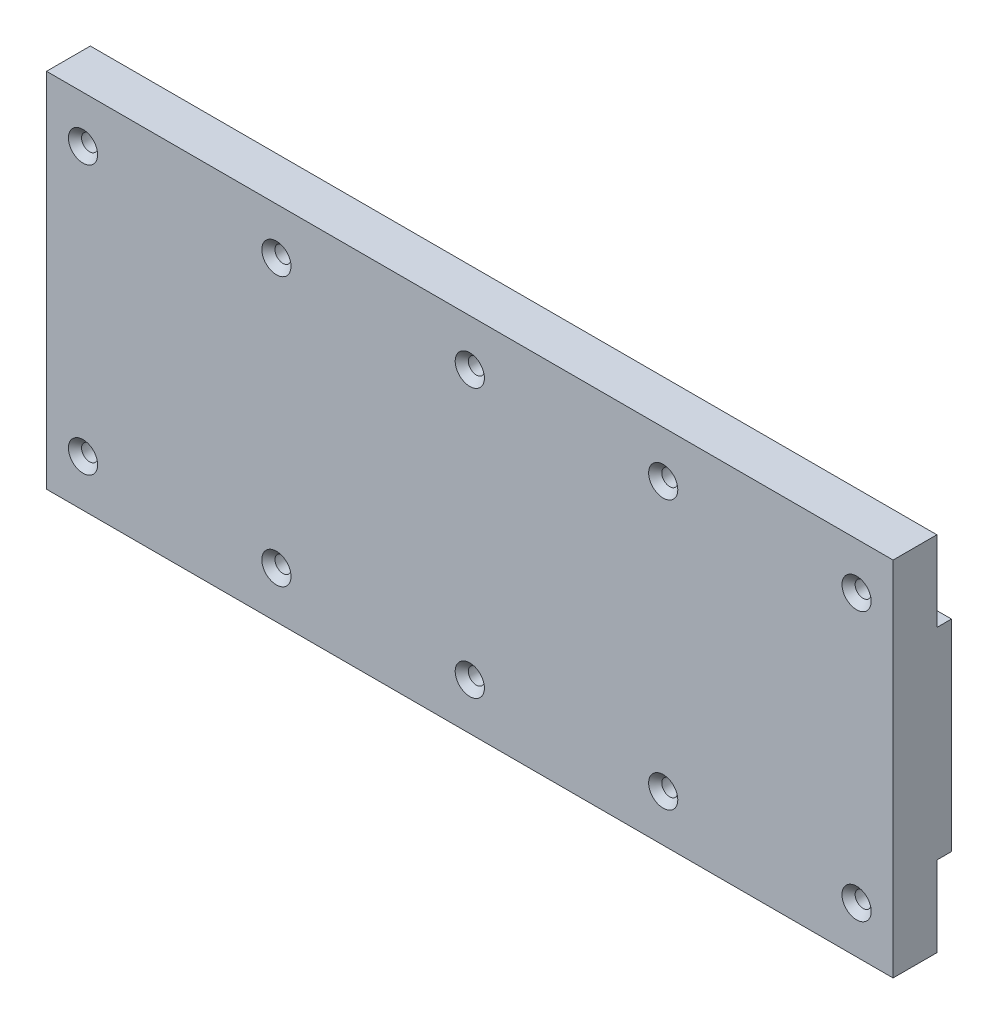
ISO-10303-21;
HEADER;
FILE_DESCRIPTION(('STEP AP214'),'2;1');
FILE_NAME('part.step','',(''),(''),'','','');
FILE_SCHEMA(('AUTOMOTIVE_DESIGN { 1 0 10303 214 1 1 1 1 }'));
ENDSEC;
DATA;
#1=APPLICATION_CONTEXT('core data for automotive mechanical design processes');
#2=APPLICATION_PROTOCOL_DEFINITION('international standard','automotive_design',2000,#1);
#3=PRODUCT_CONTEXT('',#1,'mechanical');
#4=PRODUCT('Part','Part','',(#3));
#5=PRODUCT_RELATED_PRODUCT_CATEGORY('part','',(#4));
#6=PRODUCT_DEFINITION_FORMATION('','',#4);
#7=PRODUCT_DEFINITION_CONTEXT('part definition',#1,'design');
#8=PRODUCT_DEFINITION('design','',#6,#7);
#9=PRODUCT_DEFINITION_SHAPE('','',#8);
#10=(LENGTH_UNIT() NAMED_UNIT(*) SI_UNIT(.MILLI.,.METRE.));
#11=(NAMED_UNIT(*) PLANE_ANGLE_UNIT() SI_UNIT($,.RADIAN.));
#12=(NAMED_UNIT(*) SI_UNIT($,.STERADIAN.) SOLID_ANGLE_UNIT());
#13=UNCERTAINTY_MEASURE_WITH_UNIT(LENGTH_MEASURE(1.E-05),#10,'distance_accuracy_value','');
#14=(GEOMETRIC_REPRESENTATION_CONTEXT(3) GLOBAL_UNCERTAINTY_ASSIGNED_CONTEXT((#13)) GLOBAL_UNIT_ASSIGNED_CONTEXT((#10,
#11,#12)) REPRESENTATION_CONTEXT('',''));
#15=CARTESIAN_POINT('',(0.,0.,0.));
#16=DIRECTION('',(0.,0.,1.));
#17=DIRECTION('',(1.,0.,0.));
#18=AXIS2_PLACEMENT_3D('',#15,#16,#17);
#19=CARTESIAN_POINT('',(265.,-92.,0.));
#20=DIRECTION('',(0.,0.,1.));
#21=DIRECTION('',(1.,0.,0.));
#22=AXIS2_PLACEMENT_3D('',#19,#20,#21);
#23=CONICAL_SURFACE('',#22,10.,0.78539816339745);
#24=CARTESIAN_POINT('',(265.,-92.,-4.49999999999999));
#25=DIRECTION('',(0.,0.,1.));
#26=DIRECTION('',(1.,0.,0.));
#27=AXIS2_PLACEMENT_3D('',#24,#25,#26);
#28=CIRCLE('',#27,5.50000000000001);
#29=CARTESIAN_POINT('',(270.5,-92.,-4.49999999999999));
#30=VERTEX_POINT('',#29);
#31=EDGE_CURVE('E11',#30,#30,#28,.T.);
#32=ORIENTED_EDGE('',*,*,#31,.F.);
#33=EDGE_LOOP('',(#32));
#34=FACE_BOUND('',#33,.T.);
#35=CARTESIAN_POINT('',(265.,-92.,0.));
#36=DIRECTION('',(0.,0.,1.));
#37=DIRECTION('',(1.,0.,0.));
#38=AXIS2_PLACEMENT_3D('',#35,#36,#37);
#39=CIRCLE('',#38,10.);
#40=CARTESIAN_POINT('',(275.,-92.,0.));
#41=VERTEX_POINT('',#40);
#42=EDGE_CURVE('E217',#41,#41,#39,.T.);
#43=ORIENTED_EDGE('',*,*,#42,.T.);
#44=EDGE_LOOP('',(#43));
#45=FACE_BOUND('',#44,.T.);
#46=ADVANCED_FACE('F33',(#34,#45),#23,.F.);
#47=CARTESIAN_POINT('',(265.,-92.,0.));
#48=DIRECTION('',(0.,0.,1.));
#49=DIRECTION('',(1.,0.,0.));
#50=AXIS2_PLACEMENT_3D('',#47,#48,#49);
#51=CYLINDRICAL_SURFACE('',#50,5.50000000000001);
#52=CARTESIAN_POINT('',(265.,-92.,-30.));
#53=DIRECTION('',(0.,0.,-1.));
#54=DIRECTION('',(0.,1.,0.));
#55=AXIS2_PLACEMENT_3D('',#52,#53,#54);
#56=CIRCLE('',#55,5.50000000000001);
#57=CARTESIAN_POINT('',(265.,-86.5,-30.));
#58=VERTEX_POINT('',#57);
#59=EDGE_CURVE('E40',#58,#58,#56,.T.);
#60=ORIENTED_EDGE('',*,*,#59,.T.);
#61=EDGE_LOOP('',(#60));
#62=FACE_BOUND('',#61,.T.);
#63=ORIENTED_EDGE('',*,*,#31,.T.);
#64=EDGE_LOOP('',(#63));
#65=FACE_BOUND('',#64,.T.);
#66=ADVANCED_FACE('F222',(#62,#65),#51,.F.);
#67=CARTESIAN_POINT('',(132.5,-92.,0.));
#68=DIRECTION('',(0.,0.,1.));
#69=DIRECTION('',(1.,0.,0.));
#70=AXIS2_PLACEMENT_3D('',#67,#68,#69);
#71=CONICAL_SURFACE('',#70,10.,0.78539816339745);
#72=CARTESIAN_POINT('',(132.5,-92.,-4.49999999999999));
#73=DIRECTION('',(0.,0.,1.));
#74=DIRECTION('',(1.,0.,0.));
#75=AXIS2_PLACEMENT_3D('',#72,#73,#74);
#76=CIRCLE('',#75,5.50000000000001);
#77=CARTESIAN_POINT('',(138.,-92.,-4.49999999999999));
#78=VERTEX_POINT('',#77);
#79=EDGE_CURVE('E214',#78,#78,#76,.T.);
#80=ORIENTED_EDGE('',*,*,#79,.F.);
#81=EDGE_LOOP('',(#80));
#82=FACE_BOUND('',#81,.T.);
#83=CARTESIAN_POINT('',(132.5,-92.,0.));
#84=DIRECTION('',(0.,0.,1.));
#85=DIRECTION('',(1.,0.,0.));
#86=AXIS2_PLACEMENT_3D('',#83,#84,#85);
#87=CIRCLE('',#86,10.);
#88=CARTESIAN_POINT('',(142.5,-92.,0.));
#89=VERTEX_POINT('',#88);
#90=EDGE_CURVE('E208',#89,#89,#87,.T.);
#91=ORIENTED_EDGE('',*,*,#90,.T.);
#92=EDGE_LOOP('',(#91));
#93=FACE_BOUND('',#92,.T.);
#94=ADVANCED_FACE('F252',(#82,#93),#71,.F.);
#95=CARTESIAN_POINT('',(132.5,-92.,0.));
#96=DIRECTION('',(0.,0.,1.));
#97=DIRECTION('',(1.,0.,0.));
#98=AXIS2_PLACEMENT_3D('',#95,#96,#97);
#99=CYLINDRICAL_SURFACE('',#98,5.50000000000001);
#100=CARTESIAN_POINT('',(132.5,-92.,-30.));
#101=DIRECTION('',(0.,0.,-1.));
#102=DIRECTION('',(0.,1.,0.));
#103=AXIS2_PLACEMENT_3D('',#100,#101,#102);
#104=CIRCLE('',#103,5.50000000000001);
#105=CARTESIAN_POINT('',(132.5,-86.5,-30.));
#106=VERTEX_POINT('',#105);
#107=EDGE_CURVE('E211',#106,#106,#104,.T.);
#108=ORIENTED_EDGE('',*,*,#107,.T.);
#109=EDGE_LOOP('',(#108));
#110=FACE_BOUND('',#109,.T.);
#111=ORIENTED_EDGE('',*,*,#79,.T.);
#112=EDGE_LOOP('',(#111));
#113=FACE_BOUND('',#112,.T.);
#114=ADVANCED_FACE('F301',(#110,#113),#99,.F.);
#115=CARTESIAN_POINT('',(0.,-92.,0.));
#116=DIRECTION('',(0.,0.,1.));
#117=DIRECTION('',(1.,0.,0.));
#118=AXIS2_PLACEMENT_3D('',#115,#116,#117);
#119=CONICAL_SURFACE('',#118,10.,0.78539816339745);
#120=CARTESIAN_POINT('',(0.,-92.,-4.49999999999999));
#121=DIRECTION('',(0.,0.,1.));
#122=DIRECTION('',(1.,0.,0.));
#123=AXIS2_PLACEMENT_3D('',#120,#121,#122);
#124=CIRCLE('',#123,5.50000000000001);
#125=CARTESIAN_POINT('',(5.50000000000001,-92.,-4.49999999999999));
#126=VERTEX_POINT('',#125);
#127=EDGE_CURVE('E205',#126,#126,#124,.T.);
#128=ORIENTED_EDGE('',*,*,#127,.F.);
#129=EDGE_LOOP('',(#128));
#130=FACE_BOUND('',#129,.T.);
#131=CARTESIAN_POINT('',(0.,-92.,0.));
#132=DIRECTION('',(0.,0.,1.));
#133=DIRECTION('',(1.,0.,0.));
#134=AXIS2_PLACEMENT_3D('',#131,#132,#133);
#135=CIRCLE('',#134,10.);
#136=CARTESIAN_POINT('',(10.,-92.,0.));
#137=VERTEX_POINT('',#136);
#138=EDGE_CURVE('E199',#137,#137,#135,.T.);
#139=ORIENTED_EDGE('',*,*,#138,.T.);
#140=EDGE_LOOP('',(#139));
#141=FACE_BOUND('',#140,.T.);
#142=ADVANCED_FACE('F297',(#130,#141),#119,.F.);
#143=CARTESIAN_POINT('',(0.,-92.,0.));
#144=DIRECTION('',(0.,0.,1.));
#145=DIRECTION('',(1.,0.,0.));
#146=AXIS2_PLACEMENT_3D('',#143,#144,#145);
#147=CYLINDRICAL_SURFACE('',#146,5.50000000000001);
#148=CARTESIAN_POINT('',(0.,-92.,-30.));
#149=DIRECTION('',(0.,0.,-1.));
#150=DIRECTION('',(0.,1.,0.));
#151=AXIS2_PLACEMENT_3D('',#148,#149,#150);
#152=CIRCLE('',#151,5.50000000000001);
#153=CARTESIAN_POINT('',(0.,-86.5,-30.));
#154=VERTEX_POINT('',#153);
#155=EDGE_CURVE('E202',#154,#154,#152,.T.);
#156=ORIENTED_EDGE('',*,*,#155,.T.);
#157=EDGE_LOOP('',(#156));
#158=FACE_BOUND('',#157,.T.);
#159=ORIENTED_EDGE('',*,*,#127,.T.);
#160=EDGE_LOOP('',(#159));
#161=FACE_BOUND('',#160,.T.);
#162=ADVANCED_FACE('F293',(#158,#161),#147,.F.);
#163=CARTESIAN_POINT('',(265.,92.,0.));
#164=DIRECTION('',(0.,0.,1.));
#165=DIRECTION('',(1.,0.,0.));
#166=AXIS2_PLACEMENT_3D('',#163,#164,#165);
#167=CONICAL_SURFACE('',#166,10.,0.78539816339745);
#168=CARTESIAN_POINT('',(265.,92.,-4.49999999999999));
#169=DIRECTION('',(0.,0.,1.));
#170=DIRECTION('',(1.,0.,0.));
#171=AXIS2_PLACEMENT_3D('',#168,#169,#170);
#172=CIRCLE('',#171,5.50000000000001);
#173=CARTESIAN_POINT('',(270.5,92.,-4.49999999999999));
#174=VERTEX_POINT('',#173);
#175=EDGE_CURVE('E196',#174,#174,#172,.T.);
#176=ORIENTED_EDGE('',*,*,#175,.F.);
#177=EDGE_LOOP('',(#176));
#178=FACE_BOUND('',#177,.T.);
#179=CARTESIAN_POINT('',(265.,92.,0.));
#180=DIRECTION('',(0.,0.,1.));
#181=DIRECTION('',(1.,0.,0.));
#182=AXIS2_PLACEMENT_3D('',#179,#180,#181);
#183=CIRCLE('',#182,10.);
#184=CARTESIAN_POINT('',(275.,92.,0.));
#185=VERTEX_POINT('',#184);
#186=EDGE_CURVE('E190',#185,#185,#183,.T.);
#187=ORIENTED_EDGE('',*,*,#186,.T.);
#188=EDGE_LOOP('',(#187));
#189=FACE_BOUND('',#188,.T.);
#190=ADVANCED_FACE('F289',(#178,#189),#167,.F.);
#191=CARTESIAN_POINT('',(265.,92.,0.));
#192=DIRECTION('',(0.,0.,1.));
#193=DIRECTION('',(1.,0.,0.));
#194=AXIS2_PLACEMENT_3D('',#191,#192,#193);
#195=CYLINDRICAL_SURFACE('',#194,5.50000000000001);
#196=CARTESIAN_POINT('',(265.,92.,-30.));
#197=DIRECTION('',(0.,0.,-1.));
#198=DIRECTION('',(0.,1.,0.));
#199=AXIS2_PLACEMENT_3D('',#196,#197,#198);
#200=CIRCLE('',#199,5.50000000000001);
#201=CARTESIAN_POINT('',(265.,97.5,-29.9999999999999));
#202=VERTEX_POINT('',#201);
#203=EDGE_CURVE('E193',#202,#202,#200,.T.);
#204=ORIENTED_EDGE('',*,*,#203,.T.);
#205=EDGE_LOOP('',(#204));
#206=FACE_BOUND('',#205,.T.);
#207=ORIENTED_EDGE('',*,*,#175,.T.);
#208=EDGE_LOOP('',(#207));
#209=FACE_BOUND('',#208,.T.);
#210=ADVANCED_FACE('F285',(#206,#209),#195,.F.);
#211=CARTESIAN_POINT('',(132.5,92.,0.));
#212=DIRECTION('',(0.,0.,1.));
#213=DIRECTION('',(1.,0.,0.));
#214=AXIS2_PLACEMENT_3D('',#211,#212,#213);
#215=CONICAL_SURFACE('',#214,10.,0.78539816339745);
#216=CARTESIAN_POINT('',(132.5,92.,-4.49999999999999));
#217=DIRECTION('',(0.,0.,1.));
#218=DIRECTION('',(1.,0.,0.));
#219=AXIS2_PLACEMENT_3D('',#216,#217,#218);
#220=CIRCLE('',#219,5.50000000000001);
#221=CARTESIAN_POINT('',(138.,92.,-4.49999999999999));
#222=VERTEX_POINT('',#221);
#223=EDGE_CURVE('E187',#222,#222,#220,.T.);
#224=ORIENTED_EDGE('',*,*,#223,.F.);
#225=EDGE_LOOP('',(#224));
#226=FACE_BOUND('',#225,.T.);
#227=CARTESIAN_POINT('',(132.5,92.,0.));
#228=DIRECTION('',(0.,0.,1.));
#229=DIRECTION('',(1.,0.,0.));
#230=AXIS2_PLACEMENT_3D('',#227,#228,#229);
#231=CIRCLE('',#230,10.);
#232=CARTESIAN_POINT('',(142.5,92.,0.));
#233=VERTEX_POINT('',#232);
#234=EDGE_CURVE('E181',#233,#233,#231,.T.);
#235=ORIENTED_EDGE('',*,*,#234,.T.);
#236=EDGE_LOOP('',(#235));
#237=FACE_BOUND('',#236,.T.);
#238=ADVANCED_FACE('F281',(#226,#237),#215,.F.);
#239=CARTESIAN_POINT('',(132.5,92.,0.));
#240=DIRECTION('',(0.,0.,1.));
#241=DIRECTION('',(1.,0.,0.));
#242=AXIS2_PLACEMENT_3D('',#239,#240,#241);
#243=CYLINDRICAL_SURFACE('',#242,5.50000000000001);
#244=CARTESIAN_POINT('',(132.5,92.,-30.));
#245=DIRECTION('',(0.,0.,-1.));
#246=DIRECTION('',(0.,1.,0.));
#247=AXIS2_PLACEMENT_3D('',#244,#245,#246);
#248=CIRCLE('',#247,5.50000000000001);
#249=CARTESIAN_POINT('',(132.5,97.5,-29.9999999999999));
#250=VERTEX_POINT('',#249);
#251=EDGE_CURVE('E184',#250,#250,#248,.T.);
#252=ORIENTED_EDGE('',*,*,#251,.T.);
#253=EDGE_LOOP('',(#252));
#254=FACE_BOUND('',#253,.T.);
#255=ORIENTED_EDGE('',*,*,#223,.T.);
#256=EDGE_LOOP('',(#255));
#257=FACE_BOUND('',#256,.T.);
#258=ADVANCED_FACE('F277',(#254,#257),#243,.F.);
#259=CARTESIAN_POINT('',(0.,92.,0.));
#260=DIRECTION('',(0.,0.,1.));
#261=DIRECTION('',(1.,0.,0.));
#262=AXIS2_PLACEMENT_3D('',#259,#260,#261);
#263=CONICAL_SURFACE('',#262,10.,0.78539816339745);
#264=CARTESIAN_POINT('',(0.,92.,-4.49999999999999));
#265=DIRECTION('',(0.,0.,1.));
#266=DIRECTION('',(1.,0.,0.));
#267=AXIS2_PLACEMENT_3D('',#264,#265,#266);
#268=CIRCLE('',#267,5.50000000000001);
#269=CARTESIAN_POINT('',(5.50000000000001,92.,-4.49999999999999));
#270=VERTEX_POINT('',#269);
#271=EDGE_CURVE('E178',#270,#270,#268,.T.);
#272=ORIENTED_EDGE('',*,*,#271,.F.);
#273=EDGE_LOOP('',(#272));
#274=FACE_BOUND('',#273,.T.);
#275=CARTESIAN_POINT('',(0.,92.,0.));
#276=DIRECTION('',(0.,0.,1.));
#277=DIRECTION('',(1.,0.,0.));
#278=AXIS2_PLACEMENT_3D('',#275,#276,#277);
#279=CIRCLE('',#278,10.);
#280=CARTESIAN_POINT('',(10.,92.,0.));
#281=VERTEX_POINT('',#280);
#282=EDGE_CURVE('E157',#281,#281,#279,.T.);
#283=ORIENTED_EDGE('',*,*,#282,.T.);
#284=EDGE_LOOP('',(#283));
#285=FACE_BOUND('',#284,.T.);
#286=ADVANCED_FACE('F273',(#274,#285),#263,.F.);
#287=CARTESIAN_POINT('',(0.,92.,0.));
#288=DIRECTION('',(0.,0.,1.));
#289=DIRECTION('',(1.,0.,0.));
#290=AXIS2_PLACEMENT_3D('',#287,#288,#289);
#291=CYLINDRICAL_SURFACE('',#290,5.50000000000001);
#292=CARTESIAN_POINT('',(0.,92.,-30.));
#293=DIRECTION('',(0.,0.,-1.));
#294=DIRECTION('',(0.,1.,0.));
#295=AXIS2_PLACEMENT_3D('',#292,#293,#294);
#296=CIRCLE('',#295,5.50000000000001);
#297=CARTESIAN_POINT('',(0.,97.5,-29.9999999999999));
#298=VERTEX_POINT('',#297);
#299=EDGE_CURVE('E175',#298,#298,#296,.T.);
#300=ORIENTED_EDGE('',*,*,#299,.T.);
#301=EDGE_LOOP('',(#300));
#302=FACE_BOUND('',#301,.T.);
#303=ORIENTED_EDGE('',*,*,#271,.T.);
#304=EDGE_LOOP('',(#303));
#305=FACE_BOUND('',#304,.T.);
#306=ADVANCED_FACE('F270',(#302,#305),#291,.F.);
#307=CARTESIAN_POINT('',(-290.,69.,0.));
#308=DIRECTION('',(0.,1.,0.));
#309=DIRECTION('',(0.,0.,1.));
#310=AXIS2_PLACEMENT_3D('',#307,#308,#309);
#311=PLANE('',#310);
#312=DIRECTION('',(1.,0.,0.));
#313=VECTOR('',#312,1.);
#314=CARTESIAN_POINT('',(-290.,69.,-30.));
#315=LINE('',#314,#313);
#316=CARTESIAN_POINT('',(-290.,69.,-30.));
#317=VERTEX_POINT('',#316);
#318=CARTESIAN_POINT('',(290.,69.,-30.));
#319=VERTEX_POINT('',#318);
#320=EDGE_CURVE('E96',#317,#319,#315,.T.);
#321=ORIENTED_EDGE('',*,*,#320,.T.);
#322=DIRECTION('',(0.,0.,1.));
#323=VECTOR('',#322,1.);
#324=CARTESIAN_POINT('',(290.,69.,0.));
#325=LINE('',#324,#323);
#326=CARTESIAN_POINT('',(290.,69.,-39.9999999999999));
#327=VERTEX_POINT('',#326);
#328=EDGE_CURVE('E100',#327,#319,#325,.T.);
#329=ORIENTED_EDGE('',*,*,#328,.F.);
#330=DIRECTION('',(1.,0.,0.));
#331=VECTOR('',#330,1.);
#332=CARTESIAN_POINT('',(-290.,69.,-39.9999999999999));
#333=LINE('',#332,#331);
#334=CARTESIAN_POINT('',(-290.,69.,-39.9999999999999));
#335=VERTEX_POINT('',#334);
#336=EDGE_CURVE('E47',#335,#327,#333,.T.);
#337=ORIENTED_EDGE('',*,*,#336,.F.);
#338=DIRECTION('',(0.,0.,1.));
#339=VECTOR('',#338,1.);
#340=CARTESIAN_POINT('',(-290.,69.,0.));
#341=LINE('',#340,#339);
#342=EDGE_CURVE('E101',#335,#317,#341,.T.);
#343=ORIENTED_EDGE('',*,*,#342,.T.);
#344=EDGE_LOOP('',(#321,#329,#337,#343));
#345=FACE_BOUND('',#344,.T.);
#346=ADVANCED_FACE('F98',(#345),#311,.T.);
#347=CARTESIAN_POINT('',(-290.,0.,-40.));
#348=DIRECTION('',(0.,0.,-1.));
#349=DIRECTION('',(0.,1.,0.));
#350=AXIS2_PLACEMENT_3D('',#347,#348,#349);
#351=PLANE('',#350);
#352=ORIENTED_EDGE('',*,*,#336,.T.);
#353=DIRECTION('',(0.,1.,0.));
#354=VECTOR('',#353,1.);
#355=CARTESIAN_POINT('',(290.,0.,-40.));
#356=LINE('',#355,#354);
#357=CARTESIAN_POINT('',(290.,-69.,-40.));
#358=VERTEX_POINT('',#357);
#359=EDGE_CURVE('E121',#358,#327,#356,.T.);
#360=ORIENTED_EDGE('',*,*,#359,.F.);
#361=DIRECTION('',(1.,0.,0.));
#362=VECTOR('',#361,1.);
#363=CARTESIAN_POINT('',(-290.,-69.,-40.));
#364=LINE('',#363,#362);
#365=CARTESIAN_POINT('',(-290.,-69.,-40.));
#366=VERTEX_POINT('',#365);
#367=EDGE_CURVE('E55',#366,#358,#364,.T.);
#368=ORIENTED_EDGE('',*,*,#367,.F.);
#369=DIRECTION('',(0.,1.,0.));
#370=VECTOR('',#369,1.);
#371=CARTESIAN_POINT('',(-290.,0.,-40.));
#372=LINE('',#371,#370);
#373=EDGE_CURVE('E106',#366,#335,#372,.T.);
#374=ORIENTED_EDGE('',*,*,#373,.T.);
#375=EDGE_LOOP('',(#352,#360,#368,#374));
#376=FACE_BOUND('',#375,.T.);
#377=ADVANCED_FACE('F238',(#376),#351,.T.);
#378=CARTESIAN_POINT('',(-290.,-69.,0.));
#379=DIRECTION('',(0.,-1.,0.));
#380=DIRECTION('',(0.,0.,-1.));
#381=AXIS2_PLACEMENT_3D('',#378,#379,#380);
#382=PLANE('',#381);
#383=ORIENTED_EDGE('',*,*,#367,.T.);
#384=DIRECTION('',(0.,0.,-1.));
#385=VECTOR('',#384,1.);
#386=CARTESIAN_POINT('',(290.,-69.,0.));
#387=LINE('',#386,#385);
#388=CARTESIAN_POINT('',(290.,-69.,-30.));
#389=VERTEX_POINT('',#388);
#390=EDGE_CURVE('E137',#389,#358,#387,.T.);
#391=ORIENTED_EDGE('',*,*,#390,.F.);
#392=DIRECTION('',(1.,0.,0.));
#393=VECTOR('',#392,1.);
#394=CARTESIAN_POINT('',(-290.,-69.,-30.));
#395=LINE('',#394,#393);
#396=CARTESIAN_POINT('',(-290.,-69.,-30.));
#397=VERTEX_POINT('',#396);
#398=EDGE_CURVE('E159',#397,#389,#395,.T.);
#399=ORIENTED_EDGE('',*,*,#398,.F.);
#400=DIRECTION('',(0.,0.,-1.));
#401=VECTOR('',#400,1.);
#402=CARTESIAN_POINT('',(-290.,-69.,0.));
#403=LINE('',#402,#401);
#404=EDGE_CURVE('E153',#397,#366,#403,.T.);
#405=ORIENTED_EDGE('',*,*,#404,.T.);
#406=EDGE_LOOP('',(#383,#391,#399,#405));
#407=FACE_BOUND('',#406,.T.);
#408=ADVANCED_FACE('F228',(#407),#382,.T.);
#409=CARTESIAN_POINT('',(-290.,0.,-30.));
#410=DIRECTION('',(0.,0.,-1.));
#411=DIRECTION('',(0.,1.,0.));
#412=AXIS2_PLACEMENT_3D('',#409,#410,#411);
#413=PLANE('',#412);
#414=CARTESIAN_POINT('',(-132.5,-92.,-30.));
#415=DIRECTION('',(0.,0.,-1.));
#416=DIRECTION('',(0.,1.,0.));
#417=AXIS2_PLACEMENT_3D('',#414,#415,#416);
#418=CIRCLE('',#417,5.50000000000001);
#419=CARTESIAN_POINT('',(-132.5,-86.5,-30.));
#420=VERTEX_POINT('',#419);
#421=EDGE_CURVE('E521',#420,#420,#418,.T.);
#422=ORIENTED_EDGE('',*,*,#421,.F.);
#423=EDGE_LOOP('',(#422));
#424=FACE_BOUND('',#423,.T.);
#425=CARTESIAN_POINT('',(-265.,-92.,-30.));
#426=DIRECTION('',(0.,0.,-1.));
#427=DIRECTION('',(0.,1.,0.));
#428=AXIS2_PLACEMENT_3D('',#425,#426,#427);
#429=CIRCLE('',#428,5.50000000000001);
#430=CARTESIAN_POINT('',(-265.,-86.5,-30.));
#431=VERTEX_POINT('',#430);
#432=EDGE_CURVE('E122',#431,#431,#429,.T.);
#433=ORIENTED_EDGE('',*,*,#432,.F.);
#434=EDGE_LOOP('',(#433));
#435=FACE_BOUND('',#434,.T.);
#436=ORIENTED_EDGE('',*,*,#398,.T.);
#437=DIRECTION('',(0.,1.,0.));
#438=VECTOR('',#437,1.);
#439=CARTESIAN_POINT('',(290.,0.,-30.));
#440=LINE('',#439,#438);
#441=CARTESIAN_POINT('',(290.,-124.,-30.));
#442=VERTEX_POINT('',#441);
#443=EDGE_CURVE('E117',#442,#389,#440,.T.);
#444=ORIENTED_EDGE('',*,*,#443,.F.);
#445=DIRECTION('',(1.,0.,0.));
#446=VECTOR('',#445,1.);
#447=CARTESIAN_POINT('',(-290.,-124.,-30.));
#448=LINE('',#447,#446);
#449=CARTESIAN_POINT('',(-290.,-124.,-30.));
#450=VERTEX_POINT('',#449);
#451=EDGE_CURVE('E161',#450,#442,#448,.T.);
#452=ORIENTED_EDGE('',*,*,#451,.F.);
#453=DIRECTION('',(0.,1.,0.));
#454=VECTOR('',#453,1.);
#455=CARTESIAN_POINT('',(-290.,0.,-30.));
#456=LINE('',#455,#454);
#457=EDGE_CURVE('E144',#450,#397,#456,.T.);
#458=ORIENTED_EDGE('',*,*,#457,.T.);
#459=EDGE_LOOP('',(#436,#444,#452,#458));
#460=FACE_BOUND('',#459,.T.);
#461=ORIENTED_EDGE('',*,*,#155,.F.);
#462=EDGE_LOOP('',(#461));
#463=FACE_BOUND('',#462,.T.);
#464=ORIENTED_EDGE('',*,*,#107,.F.);
#465=EDGE_LOOP('',(#464));
#466=FACE_BOUND('',#465,.T.);
#467=ORIENTED_EDGE('',*,*,#59,.F.);
#468=EDGE_LOOP('',(#467));
#469=FACE_BOUND('',#468,.T.);
#470=ADVANCED_FACE('F225',(#424,#435,#460,#463,#466,#469),#413,.T.);
#471=CARTESIAN_POINT('',(-290.,-124.,-1.14723045877933E-13));
#472=DIRECTION('',(0.,-1.,0.));
#473=DIRECTION('',(0.,0.,-1.));
#474=AXIS2_PLACEMENT_3D('',#471,#472,#473);
#475=PLANE('',#474);
#476=ORIENTED_EDGE('',*,*,#451,.T.);
#477=DIRECTION('',(0.,0.,-1.));
#478=VECTOR('',#477,1.);
#479=CARTESIAN_POINT('',(290.,-124.,-1.14723045877933E-13));
#480=LINE('',#479,#478);
#481=CARTESIAN_POINT('',(290.,-124.,0.));
#482=VERTEX_POINT('',#481);
#483=EDGE_CURVE('E134',#482,#442,#480,.T.);
#484=ORIENTED_EDGE('',*,*,#483,.F.);
#485=DIRECTION('',(1.,0.,0.));
#486=VECTOR('',#485,1.);
#487=CARTESIAN_POINT('',(-290.,-124.,0.));
#488=LINE('',#487,#486);
#489=CARTESIAN_POINT('',(-290.,-124.,0.));
#490=VERTEX_POINT('',#489);
#491=EDGE_CURVE('E163',#490,#482,#488,.T.);
#492=ORIENTED_EDGE('',*,*,#491,.F.);
#493=DIRECTION('',(0.,0.,-1.));
#494=VECTOR('',#493,1.);
#495=CARTESIAN_POINT('',(-290.,-124.,-1.14723045877933E-13));
#496=LINE('',#495,#494);
#497=EDGE_CURVE('E150',#490,#450,#496,.T.);
#498=ORIENTED_EDGE('',*,*,#497,.T.);
#499=EDGE_LOOP('',(#476,#484,#492,#498));
#500=FACE_BOUND('',#499,.T.);
#501=ADVANCED_FACE('F227',(#500),#475,.T.);
#502=CARTESIAN_POINT('',(-290.,0.,0.));
#503=DIRECTION('',(0.,0.,1.));
#504=DIRECTION('',(0.,-1.,0.));
#505=AXIS2_PLACEMENT_3D('',#502,#503,#504);
#506=PLANE('',#505);
#507=CARTESIAN_POINT('',(-132.5,-92.,0.));
#508=DIRECTION('',(0.,0.,1.));
#509=DIRECTION('',(1.,0.,0.));
#510=AXIS2_PLACEMENT_3D('',#507,#508,#509);
#511=CIRCLE('',#510,10.);
#512=CARTESIAN_POINT('',(-122.5,-92.,0.));
#513=VERTEX_POINT('',#512);
#514=EDGE_CURVE('E520',#513,#513,#511,.T.);
#515=ORIENTED_EDGE('',*,*,#514,.F.);
#516=EDGE_LOOP('',(#515));
#517=FACE_BOUND('',#516,.T.);
#518=CARTESIAN_POINT('',(-132.5,92.,0.));
#519=DIRECTION('',(0.,0.,1.));
#520=DIRECTION('',(1.,0.,0.));
#521=AXIS2_PLACEMENT_3D('',#518,#519,#520);
#522=CIRCLE('',#521,10.);
#523=CARTESIAN_POINT('',(-122.5,92.,0.));
#524=VERTEX_POINT('',#523);
#525=EDGE_CURVE('E527',#524,#524,#522,.T.);
#526=ORIENTED_EDGE('',*,*,#525,.F.);
#527=EDGE_LOOP('',(#526));
#528=FACE_BOUND('',#527,.T.);
#529=CARTESIAN_POINT('',(-265.,92.,0.));
#530=DIRECTION('',(0.,0.,1.));
#531=DIRECTION('',(1.,0.,0.));
#532=AXIS2_PLACEMENT_3D('',#529,#530,#531);
#533=CIRCLE('',#532,10.);
#534=CARTESIAN_POINT('',(-255.,92.,0.));
#535=VERTEX_POINT('',#534);
#536=EDGE_CURVE('E536',#535,#535,#533,.T.);
#537=ORIENTED_EDGE('',*,*,#536,.F.);
#538=EDGE_LOOP('',(#537));
#539=FACE_BOUND('',#538,.T.);
#540=CARTESIAN_POINT('',(-265.,-92.,0.));
#541=DIRECTION('',(0.,0.,1.));
#542=DIRECTION('',(1.,0.,0.));
#543=AXIS2_PLACEMENT_3D('',#540,#541,#542);
#544=CIRCLE('',#543,10.);
#545=CARTESIAN_POINT('',(-255.,-92.,0.));
#546=VERTEX_POINT('',#545);
#547=EDGE_CURVE('E171',#546,#546,#544,.T.);
#548=ORIENTED_EDGE('',*,*,#547,.F.);
#549=EDGE_LOOP('',(#548));
#550=FACE_BOUND('',#549,.T.);
#551=ORIENTED_EDGE('',*,*,#491,.T.);
#552=DIRECTION('',(0.,-1.,0.));
#553=VECTOR('',#552,1.);
#554=CARTESIAN_POINT('',(290.,0.,0.));
#555=LINE('',#554,#553);
#556=CARTESIAN_POINT('',(290.,124.,0.));
#557=VERTEX_POINT('',#556);
#558=EDGE_CURVE('E131',#557,#482,#555,.T.);
#559=ORIENTED_EDGE('',*,*,#558,.F.);
#560=DIRECTION('',(1.,0.,0.));
#561=VECTOR('',#560,1.);
#562=CARTESIAN_POINT('',(-290.,124.,0.));
#563=LINE('',#562,#561);
#564=CARTESIAN_POINT('',(-290.,124.,0.));
#565=VERTEX_POINT('',#564);
#566=EDGE_CURVE('E165',#565,#557,#563,.T.);
#567=ORIENTED_EDGE('',*,*,#566,.F.);
#568=DIRECTION('',(0.,-1.,0.));
#569=VECTOR('',#568,1.);
#570=CARTESIAN_POINT('',(-290.,0.,0.));
#571=LINE('',#570,#569);
#572=EDGE_CURVE('E147',#565,#490,#571,.T.);
#573=ORIENTED_EDGE('',*,*,#572,.T.);
#574=EDGE_LOOP('',(#551,#559,#567,#573));
#575=FACE_BOUND('',#574,.T.);
#576=ORIENTED_EDGE('',*,*,#282,.F.);
#577=EDGE_LOOP('',(#576));
#578=FACE_BOUND('',#577,.T.);
#579=ORIENTED_EDGE('',*,*,#234,.F.);
#580=EDGE_LOOP('',(#579));
#581=FACE_BOUND('',#580,.T.);
#582=ORIENTED_EDGE('',*,*,#186,.F.);
#583=EDGE_LOOP('',(#582));
#584=FACE_BOUND('',#583,.T.);
#585=ORIENTED_EDGE('',*,*,#138,.F.);
#586=EDGE_LOOP('',(#585));
#587=FACE_BOUND('',#586,.T.);
#588=ORIENTED_EDGE('',*,*,#90,.F.);
#589=EDGE_LOOP('',(#588));
#590=FACE_BOUND('',#589,.T.);
#591=ORIENTED_EDGE('',*,*,#42,.F.);
#592=EDGE_LOOP('',(#591));
#593=FACE_BOUND('',#592,.T.);
#594=ADVANCED_FACE('F235',(#517,#528,#539,#550,#575,#578,#581,#584,#587,#590,#593),#506,.T.);
#595=CARTESIAN_POINT('',(-290.,124.,0.));
#596=DIRECTION('',(0.,1.,0.));
#597=DIRECTION('',(0.,0.,1.));
#598=AXIS2_PLACEMENT_3D('',#595,#596,#597);
#599=PLANE('',#598);
#600=ORIENTED_EDGE('',*,*,#566,.T.);
#601=DIRECTION('',(0.,0.,1.));
#602=VECTOR('',#601,1.);
#603=CARTESIAN_POINT('',(290.,124.,0.));
#604=LINE('',#603,#602);
#605=CARTESIAN_POINT('',(290.,124.,-29.9999999999999));
#606=VERTEX_POINT('',#605);
#607=EDGE_CURVE('E115',#606,#557,#604,.T.);
#608=ORIENTED_EDGE('',*,*,#607,.F.);
#609=DIRECTION('',(1.,0.,0.));
#610=VECTOR('',#609,1.);
#611=CARTESIAN_POINT('',(-290.,124.,-29.9999999999999));
#612=LINE('',#611,#610);
#613=CARTESIAN_POINT('',(-290.,124.,-29.9999999999999));
#614=VERTEX_POINT('',#613);
#615=EDGE_CURVE('E105',#614,#606,#612,.T.);
#616=ORIENTED_EDGE('',*,*,#615,.F.);
#617=DIRECTION('',(0.,0.,1.));
#618=VECTOR('',#617,1.);
#619=CARTESIAN_POINT('',(-290.,124.,0.));
#620=LINE('',#619,#618);
#621=EDGE_CURVE('E143',#614,#565,#620,.T.);
#622=ORIENTED_EDGE('',*,*,#621,.T.);
#623=EDGE_LOOP('',(#600,#608,#616,#622));
#624=FACE_BOUND('',#623,.T.);
#625=ADVANCED_FACE('F245',(#624),#599,.T.);
#626=CARTESIAN_POINT('',(-132.5,92.,-30.));
#627=DIRECTION('',(0.,0.,-1.));
#628=DIRECTION('',(0.,1.,0.));
#629=AXIS2_PLACEMENT_3D('',#626,#627,#628);
#630=CIRCLE('',#629,5.50000000000001);
#631=CARTESIAN_POINT('',(-132.5,97.5,-29.9999999999999));
#632=VERTEX_POINT('',#631);
#633=EDGE_CURVE('E530',#632,#632,#630,.T.);
#634=ORIENTED_EDGE('',*,*,#633,.F.);
#635=EDGE_LOOP('',(#634));
#636=FACE_BOUND('',#635,.T.);
#637=CARTESIAN_POINT('',(-265.,92.,-30.));
#638=DIRECTION('',(0.,0.,-1.));
#639=DIRECTION('',(0.,1.,0.));
#640=AXIS2_PLACEMENT_3D('',#637,#638,#639);
#641=CIRCLE('',#640,5.50000000000001);
#642=CARTESIAN_POINT('',(-265.,97.5,-29.9999999999999));
#643=VERTEX_POINT('',#642);
#644=EDGE_CURVE('E168',#643,#643,#641,.T.);
#645=ORIENTED_EDGE('',*,*,#644,.F.);
#646=EDGE_LOOP('',(#645));
#647=FACE_BOUND('',#646,.T.);
#648=ORIENTED_EDGE('',*,*,#615,.T.);
#649=EDGE_CURVE('E109',#319,#606,#440,.T.);
#650=ORIENTED_EDGE('',*,*,#649,.F.);
#651=ORIENTED_EDGE('',*,*,#320,.F.);
#652=EDGE_CURVE('E141',#317,#614,#456,.T.);
#653=ORIENTED_EDGE('',*,*,#652,.T.);
#654=EDGE_LOOP('',(#648,#650,#651,#653));
#655=FACE_BOUND('',#654,.T.);
#656=ORIENTED_EDGE('',*,*,#299,.F.);
#657=EDGE_LOOP('',(#656));
#658=FACE_BOUND('',#657,.T.);
#659=ORIENTED_EDGE('',*,*,#251,.F.);
#660=EDGE_LOOP('',(#659));
#661=FACE_BOUND('',#660,.T.);
#662=ORIENTED_EDGE('',*,*,#203,.F.);
#663=EDGE_LOOP('',(#662));
#664=FACE_BOUND('',#663,.T.);
#665=ADVANCED_FACE('F110',(#636,#647,#655,#658,#661,#664),#413,.T.);
#666=CARTESIAN_POINT('',(-290.,0.,0.));
#667=DIRECTION('',(1.,0.,0.));
#668=DIRECTION('',(0.,0.,-1.));
#669=AXIS2_PLACEMENT_3D('',#666,#667,#668);
#670=PLANE('',#669);
#671=ORIENTED_EDGE('',*,*,#342,.F.);
#672=ORIENTED_EDGE('',*,*,#373,.F.);
#673=ORIENTED_EDGE('',*,*,#404,.F.);
#674=ORIENTED_EDGE('',*,*,#457,.F.);
#675=ORIENTED_EDGE('',*,*,#497,.F.);
#676=ORIENTED_EDGE('',*,*,#572,.F.);
#677=ORIENTED_EDGE('',*,*,#621,.F.);
#678=ORIENTED_EDGE('',*,*,#652,.F.);
#679=EDGE_LOOP('',(#671,#672,#673,#674,#675,#676,#677,#678));
#680=FACE_BOUND('',#679,.T.);
#681=ADVANCED_FACE('F244',(#680),#670,.F.);
#682=CARTESIAN_POINT('',(290.,0.,0.));
#683=DIRECTION('',(1.,0.,0.));
#684=DIRECTION('',(0.,0.,-1.));
#685=AXIS2_PLACEMENT_3D('',#682,#683,#684);
#686=PLANE('',#685);
#687=ORIENTED_EDGE('',*,*,#328,.T.);
#688=ORIENTED_EDGE('',*,*,#649,.T.);
#689=ORIENTED_EDGE('',*,*,#607,.T.);
#690=ORIENTED_EDGE('',*,*,#558,.T.);
#691=ORIENTED_EDGE('',*,*,#483,.T.);
#692=ORIENTED_EDGE('',*,*,#443,.T.);
#693=ORIENTED_EDGE('',*,*,#390,.T.);
#694=ORIENTED_EDGE('',*,*,#359,.T.);
#695=EDGE_LOOP('',(#687,#688,#689,#690,#691,#692,#693,#694));
#696=FACE_BOUND('',#695,.T.);
#697=ADVANCED_FACE('F119',(#696),#686,.T.);
#698=CARTESIAN_POINT('',(-265.,-92.,0.));
#699=DIRECTION('',(0.,0.,1.));
#700=DIRECTION('',(1.,0.,0.));
#701=AXIS2_PLACEMENT_3D('',#698,#699,#700);
#702=CYLINDRICAL_SURFACE('',#701,5.50000000000001);
#703=ORIENTED_EDGE('',*,*,#432,.T.);
#704=EDGE_LOOP('',(#703));
#705=FACE_BOUND('',#704,.T.);
#706=CARTESIAN_POINT('',(-265.,-92.,-4.49999999999999));
#707=DIRECTION('',(0.,0.,1.));
#708=DIRECTION('',(1.,0.,0.));
#709=AXIS2_PLACEMENT_3D('',#706,#707,#708);
#710=CIRCLE('',#709,5.50000000000001);
#711=CARTESIAN_POINT('',(-259.5,-92.,-4.49999999999999));
#712=VERTEX_POINT('',#711);
#713=EDGE_CURVE('E125',#712,#712,#710,.T.);
#714=ORIENTED_EDGE('',*,*,#713,.T.);
#715=EDGE_LOOP('',(#714));
#716=FACE_BOUND('',#715,.T.);
#717=ADVANCED_FACE('F403',(#705,#716),#702,.F.);
#718=CARTESIAN_POINT('',(-265.,-92.,0.));
#719=DIRECTION('',(0.,0.,1.));
#720=DIRECTION('',(1.,0.,0.));
#721=AXIS2_PLACEMENT_3D('',#718,#719,#720);
#722=CONICAL_SURFACE('',#721,10.,0.78539816339745);
#723=ORIENTED_EDGE('',*,*,#713,.F.);
#724=EDGE_LOOP('',(#723));
#725=FACE_BOUND('',#724,.T.);
#726=ORIENTED_EDGE('',*,*,#547,.T.);
#727=EDGE_LOOP('',(#726));
#728=FACE_BOUND('',#727,.T.);
#729=ADVANCED_FACE('F412',(#725,#728),#722,.F.);
#730=CARTESIAN_POINT('',(-265.,92.,0.));
#731=DIRECTION('',(0.,0.,1.));
#732=DIRECTION('',(1.,0.,0.));
#733=AXIS2_PLACEMENT_3D('',#730,#731,#732);
#734=CYLINDRICAL_SURFACE('',#733,5.50000000000001);
#735=ORIENTED_EDGE('',*,*,#644,.T.);
#736=EDGE_LOOP('',(#735));
#737=FACE_BOUND('',#736,.T.);
#738=CARTESIAN_POINT('',(-265.,92.,-4.49999999999999));
#739=DIRECTION('',(0.,0.,1.));
#740=DIRECTION('',(1.,0.,0.));
#741=AXIS2_PLACEMENT_3D('',#738,#739,#740);
#742=CIRCLE('',#741,5.50000000000001);
#743=CARTESIAN_POINT('',(-259.5,92.,-4.49999999999999));
#744=VERTEX_POINT('',#743);
#745=EDGE_CURVE('E172',#744,#744,#742,.T.);
#746=ORIENTED_EDGE('',*,*,#745,.T.);
#747=EDGE_LOOP('',(#746));
#748=FACE_BOUND('',#747,.T.);
#749=ADVANCED_FACE('F422',(#737,#748),#734,.F.);
#750=CARTESIAN_POINT('',(-265.,92.,0.));
#751=DIRECTION('',(0.,0.,1.));
#752=DIRECTION('',(1.,0.,0.));
#753=AXIS2_PLACEMENT_3D('',#750,#751,#752);
#754=CONICAL_SURFACE('',#753,10.,0.78539816339745);
#755=ORIENTED_EDGE('',*,*,#745,.F.);
#756=EDGE_LOOP('',(#755));
#757=FACE_BOUND('',#756,.T.);
#758=ORIENTED_EDGE('',*,*,#536,.T.);
#759=EDGE_LOOP('',(#758));
#760=FACE_BOUND('',#759,.T.);
#761=ADVANCED_FACE('F432',(#757,#760),#754,.F.);
#762=CARTESIAN_POINT('',(-132.5,92.,0.));
#763=DIRECTION('',(0.,0.,1.));
#764=DIRECTION('',(1.,0.,0.));
#765=AXIS2_PLACEMENT_3D('',#762,#763,#764);
#766=CYLINDRICAL_SURFACE('',#765,5.50000000000001);
#767=ORIENTED_EDGE('',*,*,#633,.T.);
#768=EDGE_LOOP('',(#767));
#769=FACE_BOUND('',#768,.T.);
#770=CARTESIAN_POINT('',(-132.5,92.,-4.49999999999999));
#771=DIRECTION('',(0.,0.,1.));
#772=DIRECTION('',(1.,0.,0.));
#773=AXIS2_PLACEMENT_3D('',#770,#771,#772);
#774=CIRCLE('',#773,5.50000000000001);
#775=CARTESIAN_POINT('',(-127.,92.,-4.49999999999999));
#776=VERTEX_POINT('',#775);
#777=EDGE_CURVE('E533',#776,#776,#774,.T.);
#778=ORIENTED_EDGE('',*,*,#777,.T.);
#779=EDGE_LOOP('',(#778));
#780=FACE_BOUND('',#779,.T.);
#781=ADVANCED_FACE('F441',(#769,#780),#766,.F.);
#782=CARTESIAN_POINT('',(-132.5,92.,0.));
#783=DIRECTION('',(0.,0.,1.));
#784=DIRECTION('',(1.,0.,0.));
#785=AXIS2_PLACEMENT_3D('',#782,#783,#784);
#786=CONICAL_SURFACE('',#785,10.,0.78539816339745);
#787=ORIENTED_EDGE('',*,*,#777,.F.);
#788=EDGE_LOOP('',(#787));
#789=FACE_BOUND('',#788,.T.);
#790=ORIENTED_EDGE('',*,*,#525,.T.);
#791=EDGE_LOOP('',(#790));
#792=FACE_BOUND('',#791,.T.);
#793=ADVANCED_FACE('F481',(#789,#792),#786,.F.);
#794=CARTESIAN_POINT('',(-132.5,-92.,0.));
#795=DIRECTION('',(0.,0.,1.));
#796=DIRECTION('',(1.,0.,0.));
#797=AXIS2_PLACEMENT_3D('',#794,#795,#796);
#798=CYLINDRICAL_SURFACE('',#797,5.50000000000001);
#799=ORIENTED_EDGE('',*,*,#421,.T.);
#800=EDGE_LOOP('',(#799));
#801=FACE_BOUND('',#800,.T.);
#802=CARTESIAN_POINT('',(-132.5,-92.,-4.49999999999999));
#803=DIRECTION('',(0.,0.,1.));
#804=DIRECTION('',(1.,0.,0.));
#805=AXIS2_PLACEMENT_3D('',#802,#803,#804);
#806=CIRCLE('',#805,5.50000000000001);
#807=CARTESIAN_POINT('',(-127.,-92.,-4.49999999999999));
#808=VERTEX_POINT('',#807);
#809=EDGE_CURVE('E518',#808,#808,#806,.T.);
#810=ORIENTED_EDGE('',*,*,#809,.T.);
#811=EDGE_LOOP('',(#810));
#812=FACE_BOUND('',#811,.T.);
#813=ADVANCED_FACE('F491',(#801,#812),#798,.F.);
#814=CARTESIAN_POINT('',(-132.5,-92.,0.));
#815=DIRECTION('',(0.,0.,1.));
#816=DIRECTION('',(1.,0.,0.));
#817=AXIS2_PLACEMENT_3D('',#814,#815,#816);
#818=CONICAL_SURFACE('',#817,10.,0.78539816339745);
#819=ORIENTED_EDGE('',*,*,#809,.F.);
#820=EDGE_LOOP('',(#819));
#821=FACE_BOUND('',#820,.T.);
#822=ORIENTED_EDGE('',*,*,#514,.T.);
#823=EDGE_LOOP('',(#822));
#824=FACE_BOUND('',#823,.T.);
#825=ADVANCED_FACE('F500',(#821,#824),#818,.F.);
#826=CLOSED_SHELL('',(#46,#66,#94,#114,#142,#162,#190,#210,#238,#258,#286,#306,#346,#377,#408,
#470,#501,#594,#625,#665,#681,#697,#717,#729,#749,#761,#781,#793,#813,#825));
#827=MANIFOLD_SOLID_BREP('B2',#826);
#828=ADVANCED_BREP_SHAPE_REPRESENTATION('',(#18,#827),#14);
#829=SHAPE_DEFINITION_REPRESENTATION(#9,#828);
ENDSEC;
END-ISO-10303-21;
